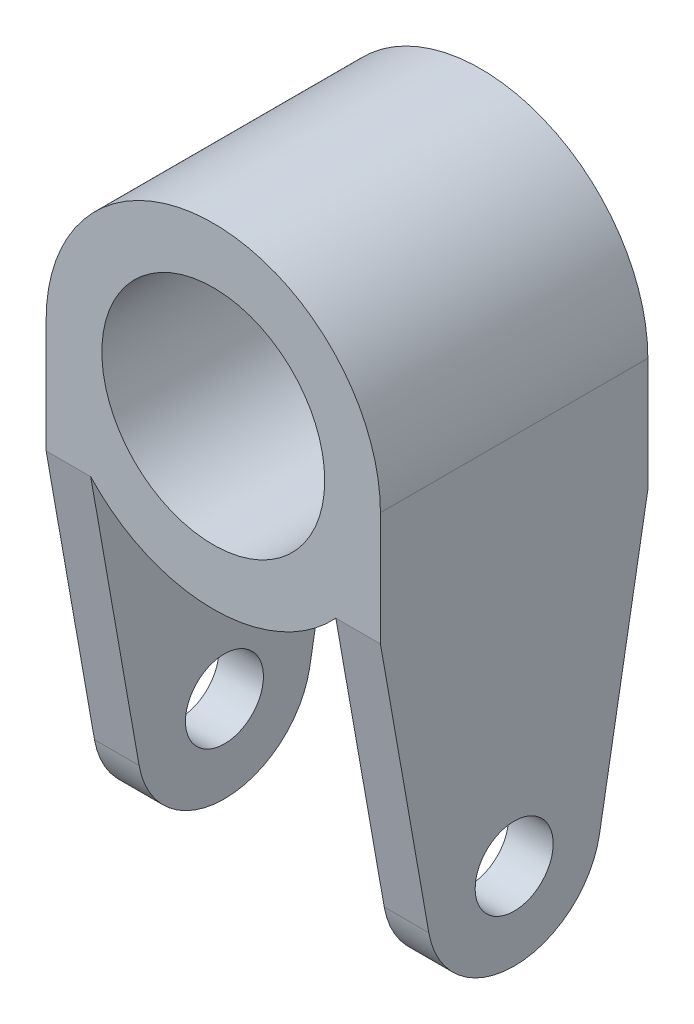
ISO-10303-21;
HEADER;
FILE_DESCRIPTION(('STEP AP214'),'2;1');
FILE_NAME('part.step','',(''),(''),'','','');
FILE_SCHEMA(('AUTOMOTIVE_DESIGN { 1 0 10303 214 1 1 1 1 }'));
ENDSEC;
DATA;
#1=APPLICATION_CONTEXT('core data for automotive mechanical design processes');
#2=APPLICATION_PROTOCOL_DEFINITION('international standard','automotive_design',2000,#1);
#3=PRODUCT_CONTEXT('',#1,'mechanical');
#4=PRODUCT('Part','Part','',(#3));
#5=PRODUCT_RELATED_PRODUCT_CATEGORY('part','',(#4));
#6=PRODUCT_DEFINITION_FORMATION('','',#4);
#7=PRODUCT_DEFINITION_CONTEXT('part definition',#1,'design');
#8=PRODUCT_DEFINITION('design','',#6,#7);
#9=PRODUCT_DEFINITION_SHAPE('','',#8);
#10=(LENGTH_UNIT() NAMED_UNIT(*) SI_UNIT(.MILLI.,.METRE.));
#11=(NAMED_UNIT(*) PLANE_ANGLE_UNIT() SI_UNIT($,.RADIAN.));
#12=(NAMED_UNIT(*) SI_UNIT($,.STERADIAN.) SOLID_ANGLE_UNIT());
#13=UNCERTAINTY_MEASURE_WITH_UNIT(LENGTH_MEASURE(1.E-05),#10,'distance_accuracy_value','');
#14=(GEOMETRIC_REPRESENTATION_CONTEXT(3) GLOBAL_UNCERTAINTY_ASSIGNED_CONTEXT((#13)) GLOBAL_UNIT_ASSIGNED_CONTEXT((#10,
#11,#12)) REPRESENTATION_CONTEXT('',''));
#15=CARTESIAN_POINT('',(0.,0.,0.));
#16=DIRECTION('',(0.,0.,1.));
#17=DIRECTION('',(1.,0.,0.));
#18=AXIS2_PLACEMENT_3D('',#15,#16,#17);
#19=CARTESIAN_POINT('',(0.,0.,24.));
#20=DIRECTION('',(0.,0.,1.));
#21=DIRECTION('',(1.,0.,0.));
#22=AXIS2_PLACEMENT_3D('',#19,#20,#21);
#23=PLANE('',#22);
#24=DIRECTION('',(1.,0.,0.));
#25=VECTOR('',#24,1.);
#26=CARTESIAN_POINT('',(-15.001,-10.1980390271856,24.));
#27=LINE('',#26,#25);
#28=CARTESIAN_POINT('',(11.,-10.1980390271856,24.));
#29=VERTEX_POINT('',#28);
#30=CARTESIAN_POINT('',(15.,-10.1980390271856,24.));
#31=VERTEX_POINT('',#30);
#32=EDGE_CURVE('E113',#29,#31,#27,.T.);
#33=ORIENTED_EDGE('',*,*,#32,.T.);
#34=DIRECTION('',(0.,1.,0.));
#35=VECTOR('',#34,1.);
#36=CARTESIAN_POINT('',(15.,-22.,24.));
#37=LINE('',#36,#35);
#38=CARTESIAN_POINT('',(15.,0.,24.));
#39=VERTEX_POINT('',#38);
#40=EDGE_CURVE('E145',#31,#39,#37,.T.);
#41=ORIENTED_EDGE('',*,*,#40,.T.);
#42=CARTESIAN_POINT('',(0.,0.,24.));
#43=DIRECTION('',(0.,0.,1.));
#44=DIRECTION('',(1.,0.,0.));
#45=AXIS2_PLACEMENT_3D('',#42,#43,#44);
#46=CIRCLE('',#45,15.);
#47=CARTESIAN_POINT('',(-15.,0.,24.));
#48=VERTEX_POINT('',#47);
#49=EDGE_CURVE('E159',#39,#48,#46,.T.);
#50=ORIENTED_EDGE('',*,*,#49,.T.);
#51=DIRECTION('',(0.,-1.,0.));
#52=VECTOR('',#51,1.);
#53=CARTESIAN_POINT('',(-15.,0.,24.));
#54=LINE('',#53,#52);
#55=CARTESIAN_POINT('',(-15.,-10.1980390271856,24.));
#56=VERTEX_POINT('',#55);
#57=EDGE_CURVE('E146',#48,#56,#54,.T.);
#58=ORIENTED_EDGE('',*,*,#57,.T.);
#59=DIRECTION('',(-1.,0.,0.));
#60=VECTOR('',#59,1.);
#61=CARTESIAN_POINT('',(15.001,-10.1980390271856,24.));
#62=LINE('',#61,#60);
#63=CARTESIAN_POINT('',(-11.,-10.1980390271856,24.));
#64=VERTEX_POINT('',#63);
#65=EDGE_CURVE('E141',#64,#56,#62,.T.);
#66=ORIENTED_EDGE('',*,*,#65,.F.);
#67=CARTESIAN_POINT('',(0.,0.,24.));
#68=DIRECTION('',(0.,0.,1.));
#69=DIRECTION('',(1.,0.,0.));
#70=AXIS2_PLACEMENT_3D('',#67,#68,#69);
#71=CIRCLE('',#70,15.);
#72=EDGE_CURVE('E138',#64,#29,#71,.T.);
#73=ORIENTED_EDGE('',*,*,#72,.T.);
#74=EDGE_LOOP('',(#33,#41,#50,#58,#66,#73));
#75=FACE_BOUND('',#74,.T.);
#76=CARTESIAN_POINT('',(0.,0.,24.));
#77=DIRECTION('',(0.,0.,1.));
#78=DIRECTION('',(1.,0.,0.));
#79=AXIS2_PLACEMENT_3D('',#76,#77,#78);
#80=CIRCLE('',#79,10.);
#81=CARTESIAN_POINT('',(10.,0.,24.));
#82=VERTEX_POINT('',#81);
#83=EDGE_CURVE('E167',#82,#82,#80,.T.);
#84=ORIENTED_EDGE('',*,*,#83,.F.);
#85=EDGE_LOOP('',(#84));
#86=FACE_BOUND('',#85,.T.);
#87=ADVANCED_FACE('F36',(#75,#86),#23,.T.);
#88=CARTESIAN_POINT('',(0.,0.,0.));
#89=DIRECTION('',(0.,0.,1.));
#90=DIRECTION('',(1.,0.,0.));
#91=AXIS2_PLACEMENT_3D('',#88,#89,#90);
#92=PLANE('',#91);
#93=DIRECTION('',(0.,1.,0.));
#94=VECTOR('',#93,1.);
#95=CARTESIAN_POINT('',(15.,0.,0.));
#96=LINE('',#95,#94);
#97=CARTESIAN_POINT('',(15.,-10.1980390271856,0.));
#98=VERTEX_POINT('',#97);
#99=CARTESIAN_POINT('',(15.,0.,0.));
#100=VERTEX_POINT('',#99);
#101=EDGE_CURVE('E157',#98,#100,#96,.T.);
#102=ORIENTED_EDGE('',*,*,#101,.F.);
#103=DIRECTION('',(1.,0.,0.));
#104=VECTOR('',#103,1.);
#105=CARTESIAN_POINT('',(-15.001,-10.1980390271856,0.));
#106=LINE('',#105,#104);
#107=CARTESIAN_POINT('',(11.,-10.1980390271856,0.));
#108=VERTEX_POINT('',#107);
#109=EDGE_CURVE('E123',#108,#98,#106,.T.);
#110=ORIENTED_EDGE('',*,*,#109,.F.);
#111=CARTESIAN_POINT('',(0.,0.,0.));
#112=DIRECTION('',(0.,0.,1.));
#113=DIRECTION('',(1.,0.,0.));
#114=AXIS2_PLACEMENT_3D('',#111,#112,#113);
#115=CIRCLE('',#114,15.);
#116=CARTESIAN_POINT('',(-11.,-10.1980390271856,0.));
#117=VERTEX_POINT('',#116);
#118=EDGE_CURVE('E151',#117,#108,#115,.T.);
#119=ORIENTED_EDGE('',*,*,#118,.F.);
#120=DIRECTION('',(-1.,0.,0.));
#121=VECTOR('',#120,1.);
#122=CARTESIAN_POINT('',(15.001,-10.1980390271856,0.));
#123=LINE('',#122,#121);
#124=CARTESIAN_POINT('',(-15.,-10.1980390271856,0.));
#125=VERTEX_POINT('',#124);
#126=EDGE_CURVE('E183',#117,#125,#123,.T.);
#127=ORIENTED_EDGE('',*,*,#126,.T.);
#128=DIRECTION('',(0.,-1.,0.));
#129=VECTOR('',#128,1.);
#130=CARTESIAN_POINT('',(-15.,-15.,0.));
#131=LINE('',#130,#129);
#132=CARTESIAN_POINT('',(-15.,0.,0.));
#133=VERTEX_POINT('',#132);
#134=EDGE_CURVE('E161',#133,#125,#131,.T.);
#135=ORIENTED_EDGE('',*,*,#134,.F.);
#136=CARTESIAN_POINT('',(0.,0.,0.));
#137=DIRECTION('',(0.,0.,1.));
#138=DIRECTION('',(1.,0.,0.));
#139=AXIS2_PLACEMENT_3D('',#136,#137,#138);
#140=CIRCLE('',#139,15.);
#141=EDGE_CURVE('E164',#100,#133,#140,.T.);
#142=ORIENTED_EDGE('',*,*,#141,.F.);
#143=EDGE_LOOP('',(#102,#110,#119,#127,#135,#142));
#144=FACE_BOUND('',#143,.T.);
#145=CARTESIAN_POINT('',(0.,0.,0.));
#146=DIRECTION('',(0.,0.,1.));
#147=DIRECTION('',(1.,0.,0.));
#148=AXIS2_PLACEMENT_3D('',#145,#146,#147);
#149=CIRCLE('',#148,10.);
#150=CARTESIAN_POINT('',(10.,0.,0.));
#151=VERTEX_POINT('',#150);
#152=EDGE_CURVE('E172',#151,#151,#149,.T.);
#153=ORIENTED_EDGE('',*,*,#152,.T.);
#154=EDGE_LOOP('',(#153));
#155=FACE_BOUND('',#154,.T.);
#156=ADVANCED_FACE('F251',(#144,#155),#92,.F.);
#157=CARTESIAN_POINT('',(0.,0.,24.));
#158=DIRECTION('',(0.,0.,-1.));
#159=DIRECTION('',(-1.,0.,0.));
#160=AXIS2_PLACEMENT_3D('',#157,#158,#159);
#161=CYLINDRICAL_SURFACE('',#160,15.);
#162=ORIENTED_EDGE('',*,*,#141,.T.);
#163=DIRECTION('',(0.,0.,-1.));
#164=VECTOR('',#163,1.);
#165=CARTESIAN_POINT('',(-15.,0.,24.));
#166=LINE('',#165,#164);
#167=EDGE_CURVE('E11',#48,#133,#166,.T.);
#168=ORIENTED_EDGE('',*,*,#167,.F.);
#169=ORIENTED_EDGE('',*,*,#49,.F.);
#170=DIRECTION('',(0.,0.,-1.));
#171=VECTOR('',#170,1.);
#172=CARTESIAN_POINT('',(15.,0.,24.));
#173=LINE('',#172,#171);
#174=EDGE_CURVE('E152',#39,#100,#173,.T.);
#175=ORIENTED_EDGE('',*,*,#174,.T.);
#176=EDGE_LOOP('',(#162,#168,#169,#175));
#177=FACE_BOUND('',#176,.T.);
#178=ADVANCED_FACE('F38',(#177),#161,.T.);
#179=CARTESIAN_POINT('',(-15.,-15.,24.));
#180=DIRECTION('',(1.,0.,0.));
#181=DIRECTION('',(0.,1.,0.));
#182=AXIS2_PLACEMENT_3D('',#179,#180,#181);
#183=PLANE('',#182);
#184=CARTESIAN_POINT('',(-15.,-33.4677805558276,12.));
#185=DIRECTION('',(-1.,0.,0.));
#186=DIRECTION('',(0.,-1.,0.));
#187=AXIS2_PLACEMENT_3D('',#184,#185,#186);
#188=CIRCLE('',#187,3.50000000000001);
#189=CARTESIAN_POINT('',(-15.,-36.9677805558276,12.));
#190=VERTEX_POINT('',#189);
#191=EDGE_CURVE('E200',#190,#190,#188,.T.);
#192=ORIENTED_EDGE('',*,*,#191,.F.);
#193=EDGE_LOOP('',(#192));
#194=FACE_BOUND('',#193,.T.);
#195=ORIENTED_EDGE('',*,*,#134,.T.);
#196=DIRECTION('',(0.,0.984807753012207,-0.173648177666935));
#197=VECTOR('',#196,1.);
#198=CARTESIAN_POINT('',(-15.,-10.1980390271856,0.));
#199=LINE('',#198,#197);
#200=CARTESIAN_POINT('',(-15.,-34.8182328524907,4.34120444167337));
#201=VERTEX_POINT('',#200);
#202=EDGE_CURVE('E192',#201,#125,#199,.T.);
#203=ORIENTED_EDGE('',*,*,#202,.F.);
#204=CARTESIAN_POINT('',(-15.,-33.4677805558276,12.));
#205=DIRECTION('',(1.,0.,0.));
#206=DIRECTION('',(0.,-1.,0.));
#207=AXIS2_PLACEMENT_3D('',#204,#205,#206);
#208=CIRCLE('',#207,7.77694482491721);
#209=CARTESIAN_POINT('',(-15.,-34.8182328524908,19.6587955583266));
#210=VERTEX_POINT('',#209);
#211=EDGE_CURVE('E195',#210,#201,#208,.T.);
#212=ORIENTED_EDGE('',*,*,#211,.F.);
#213=DIRECTION('',(0.,-0.984807753012207,-0.173648177666935));
#214=VECTOR('',#213,1.);
#215=CARTESIAN_POINT('',(-15.,-34.8182328524908,19.6587955583266));
#216=LINE('',#215,#214);
#217=EDGE_CURVE('E180',#56,#210,#216,.T.);
#218=ORIENTED_EDGE('',*,*,#217,.F.);
#219=ORIENTED_EDGE('',*,*,#57,.F.);
#220=ORIENTED_EDGE('',*,*,#167,.T.);
#221=EDGE_LOOP('',(#195,#203,#212,#218,#219,#220));
#222=FACE_BOUND('',#221,.T.);
#223=ADVANCED_FACE('F239',(#194,#222),#183,.F.);
#224=CARTESIAN_POINT('',(-11.,-42.,24.));
#225=DIRECTION('',(-1.,0.,0.));
#226=DIRECTION('',(0.,-1.,0.));
#227=AXIS2_PLACEMENT_3D('',#224,#225,#226);
#228=PLANE('',#227);
#229=CARTESIAN_POINT('',(-11.,-33.4677805558276,12.));
#230=DIRECTION('',(-1.,0.,0.));
#231=DIRECTION('',(0.,-1.,0.));
#232=AXIS2_PLACEMENT_3D('',#229,#230,#231);
#233=CIRCLE('',#232,3.50000000000001);
#234=CARTESIAN_POINT('',(-11.,-36.9677805558276,12.));
#235=VERTEX_POINT('',#234);
#236=EDGE_CURVE('E187',#235,#235,#233,.F.);
#237=ORIENTED_EDGE('',*,*,#236,.F.);
#238=EDGE_LOOP('',(#237));
#239=FACE_BOUND('',#238,.T.);
#240=CARTESIAN_POINT('',(-11.,-33.4677805558276,12.));
#241=DIRECTION('',(-1.,0.,0.));
#242=DIRECTION('',(0.,-1.,0.));
#243=AXIS2_PLACEMENT_3D('',#240,#241,#242);
#244=CIRCLE('',#243,7.77694482491721);
#245=CARTESIAN_POINT('',(-11.,-34.8182328524907,4.34120444167337));
#246=VERTEX_POINT('',#245);
#247=CARTESIAN_POINT('',(-11.,-34.8182328524908,19.6587955583266));
#248=VERTEX_POINT('',#247);
#249=EDGE_CURVE('E59',#246,#248,#244,.T.);
#250=ORIENTED_EDGE('',*,*,#249,.F.);
#251=DIRECTION('',(0.,-0.984807753012207,0.173648177666935));
#252=VECTOR('',#251,1.);
#253=CARTESIAN_POINT('',(-11.,-10.1980390271856,0.));
#254=LINE('',#253,#252);
#255=EDGE_CURVE('E189',#117,#246,#254,.T.);
#256=ORIENTED_EDGE('',*,*,#255,.F.);
#257=DIRECTION('',(0.,0.,-1.));
#258=VECTOR('',#257,1.);
#259=CARTESIAN_POINT('',(-11.,-10.1980390271856,24.));
#260=LINE('',#259,#258);
#261=EDGE_CURVE('E44',#64,#117,#260,.T.);
#262=ORIENTED_EDGE('',*,*,#261,.F.);
#263=DIRECTION('',(0.,0.984807753012207,0.173648177666935));
#264=VECTOR('',#263,1.);
#265=CARTESIAN_POINT('',(-11.,-34.8182328524908,19.6587955583266));
#266=LINE('',#265,#264);
#267=EDGE_CURVE('E175',#248,#64,#266,.T.);
#268=ORIENTED_EDGE('',*,*,#267,.F.);
#269=EDGE_LOOP('',(#250,#256,#262,#268));
#270=FACE_BOUND('',#269,.T.);
#271=ADVANCED_FACE('F247',(#239,#270),#228,.F.);
#272=CARTESIAN_POINT('',(0.,0.,24.));
#273=DIRECTION('',(0.,0.,-1.));
#274=DIRECTION('',(-1.,0.,0.));
#275=AXIS2_PLACEMENT_3D('',#272,#273,#274);
#276=CYLINDRICAL_SURFACE('',#275,15.);
#277=ORIENTED_EDGE('',*,*,#118,.T.);
#278=DIRECTION('',(0.,0.,-1.));
#279=VECTOR('',#278,1.);
#280=CARTESIAN_POINT('',(11.,-10.1980390271856,24.));
#281=LINE('',#280,#279);
#282=EDGE_CURVE('E131',#29,#108,#281,.T.);
#283=ORIENTED_EDGE('',*,*,#282,.F.);
#284=ORIENTED_EDGE('',*,*,#72,.F.);
#285=ORIENTED_EDGE('',*,*,#261,.T.);
#286=EDGE_LOOP('',(#277,#283,#284,#285));
#287=FACE_BOUND('',#286,.T.);
#288=ADVANCED_FACE('F149',(#287),#276,.T.);
#289=CARTESIAN_POINT('',(11.,-42.,24.));
#290=DIRECTION('',(1.,0.,0.));
#291=DIRECTION('',(0.,0.,-1.));
#292=AXIS2_PLACEMENT_3D('',#289,#290,#291);
#293=PLANE('',#292);
#294=CARTESIAN_POINT('',(11.,-33.4677805558276,12.));
#295=DIRECTION('',(1.,0.,0.));
#296=DIRECTION('',(0.,0.,-1.));
#297=AXIS2_PLACEMENT_3D('',#294,#295,#296);
#298=CIRCLE('',#297,3.50000000000001);
#299=CARTESIAN_POINT('',(11.,-29.9677805558276,12.));
#300=VERTEX_POINT('',#299);
#301=EDGE_CURVE('E134',#300,#300,#298,.F.);
#302=ORIENTED_EDGE('',*,*,#301,.F.);
#303=EDGE_LOOP('',(#302));
#304=FACE_BOUND('',#303,.T.);
#305=ORIENTED_EDGE('',*,*,#282,.T.);
#306=DIRECTION('',(0.,0.984807753012207,-0.173648177666935));
#307=VECTOR('',#306,1.);
#308=CARTESIAN_POINT('',(11.,-10.1980390271856,0.));
#309=LINE('',#308,#307);
#310=CARTESIAN_POINT('',(11.,-34.8182328524908,4.34120444167337));
#311=VERTEX_POINT('',#310);
#312=EDGE_CURVE('E206',#311,#108,#309,.T.);
#313=ORIENTED_EDGE('',*,*,#312,.F.);
#314=CARTESIAN_POINT('',(11.,-33.4677805558276,12.));
#315=DIRECTION('',(1.,0.,0.));
#316=DIRECTION('',(0.,0.,-1.));
#317=AXIS2_PLACEMENT_3D('',#314,#315,#316);
#318=CIRCLE('',#317,7.77694482491721);
#319=CARTESIAN_POINT('',(11.,-34.8182328524908,19.6587955583266));
#320=VERTEX_POINT('',#319);
#321=EDGE_CURVE('E133',#320,#311,#318,.T.);
#322=ORIENTED_EDGE('',*,*,#321,.F.);
#323=DIRECTION('',(0.,-0.984807753012207,-0.173648177666935));
#324=VECTOR('',#323,1.);
#325=CARTESIAN_POINT('',(11.,-34.8182328524908,19.6587955583266));
#326=LINE('',#325,#324);
#327=EDGE_CURVE('E116',#29,#320,#326,.T.);
#328=ORIENTED_EDGE('',*,*,#327,.F.);
#329=EDGE_LOOP('',(#305,#313,#322,#328));
#330=FACE_BOUND('',#329,.T.);
#331=ADVANCED_FACE('F128',(#304,#330),#293,.F.);
#332=CARTESIAN_POINT('',(15.,0.,24.));
#333=DIRECTION('',(-1.,0.,0.));
#334=DIRECTION('',(0.,-1.,0.));
#335=AXIS2_PLACEMENT_3D('',#332,#333,#334);
#336=PLANE('',#335);
#337=CARTESIAN_POINT('',(15.,-33.4677805558276,12.));
#338=DIRECTION('',(1.,0.,0.));
#339=DIRECTION('',(0.,1.,0.));
#340=AXIS2_PLACEMENT_3D('',#337,#338,#339);
#341=CIRCLE('',#340,3.50000000000001);
#342=CARTESIAN_POINT('',(15.,-29.9677805558276,12.));
#343=VERTEX_POINT('',#342);
#344=EDGE_CURVE('E219',#343,#343,#341,.T.);
#345=ORIENTED_EDGE('',*,*,#344,.F.);
#346=EDGE_LOOP('',(#345));
#347=FACE_BOUND('',#346,.T.);
#348=CARTESIAN_POINT('',(15.,-33.4677805558276,12.));
#349=DIRECTION('',(-1.,0.,0.));
#350=DIRECTION('',(0.,1.,0.));
#351=AXIS2_PLACEMENT_3D('',#348,#349,#350);
#352=CIRCLE('',#351,7.77694482491721);
#353=CARTESIAN_POINT('',(15.,-34.8182328524908,4.34120444167337));
#354=VERTEX_POINT('',#353);
#355=CARTESIAN_POINT('',(15.,-34.8182328524908,19.6587955583266));
#356=VERTEX_POINT('',#355);
#357=EDGE_CURVE('E51',#354,#356,#352,.T.);
#358=ORIENTED_EDGE('',*,*,#357,.F.);
#359=DIRECTION('',(0.,-0.984807753012207,0.173648177666935));
#360=VECTOR('',#359,1.);
#361=CARTESIAN_POINT('',(15.,-10.1980390271856,0.));
#362=LINE('',#361,#360);
#363=EDGE_CURVE('E208',#98,#354,#362,.T.);
#364=ORIENTED_EDGE('',*,*,#363,.F.);
#365=ORIENTED_EDGE('',*,*,#101,.T.);
#366=ORIENTED_EDGE('',*,*,#174,.F.);
#367=ORIENTED_EDGE('',*,*,#40,.F.);
#368=DIRECTION('',(0.,0.984807753012207,0.173648177666935));
#369=VECTOR('',#368,1.);
#370=CARTESIAN_POINT('',(15.,-34.8182328524908,19.6587955583266));
#371=LINE('',#370,#369);
#372=EDGE_CURVE('E119',#356,#31,#371,.T.);
#373=ORIENTED_EDGE('',*,*,#372,.F.);
#374=EDGE_LOOP('',(#358,#364,#365,#366,#367,#373));
#375=FACE_BOUND('',#374,.T.);
#376=ADVANCED_FACE('F226',(#347,#375),#336,.F.);
#377=CARTESIAN_POINT('',(0.,0.,24.));
#378=DIRECTION('',(0.,0.,-1.));
#379=DIRECTION('',(-1.,0.,0.));
#380=AXIS2_PLACEMENT_3D('',#377,#378,#379);
#381=CYLINDRICAL_SURFACE('',#380,10.);
#382=ORIENTED_EDGE('',*,*,#83,.T.);
#383=EDGE_LOOP('',(#382));
#384=FACE_BOUND('',#383,.T.);
#385=ORIENTED_EDGE('',*,*,#152,.F.);
#386=EDGE_LOOP('',(#385));
#387=FACE_BOUND('',#386,.T.);
#388=ADVANCED_FACE('F229',(#384,#387),#381,.F.);
#389=CARTESIAN_POINT('',(15.001,-10.1980390271856,0.));
#390=DIRECTION('',(0.,0.173648177666935,0.984807753012207));
#391=DIRECTION('',(0.,-0.984807753012207,0.173648177666935));
#392=AXIS2_PLACEMENT_3D('',#389,#390,#391);
#393=PLANE('',#392);
#394=ORIENTED_EDGE('',*,*,#255,.T.);
#395=DIRECTION('',(-1.,0.,0.));
#396=VECTOR('',#395,1.);
#397=CARTESIAN_POINT('',(15.001,-34.8182328524907,4.34120444167337));
#398=LINE('',#397,#396);
#399=EDGE_CURVE('E181',#246,#201,#398,.T.);
#400=ORIENTED_EDGE('',*,*,#399,.T.);
#401=ORIENTED_EDGE('',*,*,#202,.T.);
#402=ORIENTED_EDGE('',*,*,#126,.F.);
#403=EDGE_LOOP('',(#394,#400,#401,#402));
#404=FACE_BOUND('',#403,.T.);
#405=ADVANCED_FACE('F300',(#404),#393,.F.);
#406=CARTESIAN_POINT('',(15.001,-33.4677805558276,12.));
#407=DIRECTION('',(-1.,0.,0.));
#408=DIRECTION('',(0.,-1.,0.));
#409=AXIS2_PLACEMENT_3D('',#406,#407,#408);
#410=CYLINDRICAL_SURFACE('',#409,7.77694482491721);
#411=ORIENTED_EDGE('',*,*,#249,.T.);
#412=DIRECTION('',(-1.,0.,0.));
#413=VECTOR('',#412,1.);
#414=CARTESIAN_POINT('',(15.001,-34.8182328524907,19.6587955583266));
#415=LINE('',#414,#413);
#416=EDGE_CURVE('E178',#248,#210,#415,.T.);
#417=ORIENTED_EDGE('',*,*,#416,.T.);
#418=ORIENTED_EDGE('',*,*,#211,.T.);
#419=ORIENTED_EDGE('',*,*,#399,.F.);
#420=EDGE_LOOP('',(#411,#417,#418,#419));
#421=FACE_BOUND('',#420,.T.);
#422=ADVANCED_FACE('F296',(#421),#410,.T.);
#423=CARTESIAN_POINT('',(15.001,-34.8182328524907,19.6587955583266));
#424=DIRECTION('',(0.,0.173648177666935,-0.984807753012207));
#425=DIRECTION('',(0.,0.984807753012207,0.173648177666935));
#426=AXIS2_PLACEMENT_3D('',#423,#424,#425);
#427=PLANE('',#426);
#428=ORIENTED_EDGE('',*,*,#267,.T.);
#429=ORIENTED_EDGE('',*,*,#65,.T.);
#430=ORIENTED_EDGE('',*,*,#217,.T.);
#431=ORIENTED_EDGE('',*,*,#416,.F.);
#432=EDGE_LOOP('',(#428,#429,#430,#431));
#433=FACE_BOUND('',#432,.T.);
#434=ADVANCED_FACE('F244',(#433),#427,.F.);
#435=CARTESIAN_POINT('',(15.001,-33.4677805558276,12.));
#436=DIRECTION('',(-1.,0.,0.));
#437=DIRECTION('',(0.,-1.,0.));
#438=AXIS2_PLACEMENT_3D('',#435,#436,#437);
#439=CYLINDRICAL_SURFACE('',#438,3.50000000000001);
#440=ORIENTED_EDGE('',*,*,#191,.T.);
#441=EDGE_LOOP('',(#440));
#442=FACE_BOUND('',#441,.T.);
#443=ORIENTED_EDGE('',*,*,#236,.T.);
#444=EDGE_LOOP('',(#443));
#445=FACE_BOUND('',#444,.T.);
#446=ADVANCED_FACE('F263',(#442,#445),#439,.F.);
#447=CARTESIAN_POINT('',(-15.001,-10.1980390271856,0.));
#448=DIRECTION('',(0.,0.173648177666935,0.984807753012207));
#449=DIRECTION('',(0.,-0.984807753012207,0.173648177666935));
#450=AXIS2_PLACEMENT_3D('',#447,#448,#449);
#451=PLANE('',#450);
#452=ORIENTED_EDGE('',*,*,#312,.T.);
#453=ORIENTED_EDGE('',*,*,#109,.T.);
#454=ORIENTED_EDGE('',*,*,#363,.T.);
#455=DIRECTION('',(1.,0.,0.));
#456=VECTOR('',#455,1.);
#457=CARTESIAN_POINT('',(-15.001,-34.8182328524908,4.34120444167337));
#458=LINE('',#457,#456);
#459=EDGE_CURVE('E212',#311,#354,#458,.T.);
#460=ORIENTED_EDGE('',*,*,#459,.F.);
#461=EDGE_LOOP('',(#452,#453,#454,#460));
#462=FACE_BOUND('',#461,.T.);
#463=ADVANCED_FACE('F254',(#462),#451,.F.);
#464=CARTESIAN_POINT('',(-15.001,-33.4677805558276,12.));
#465=DIRECTION('',(1.,0.,0.));
#466=DIRECTION('',(0.,1.,0.));
#467=AXIS2_PLACEMENT_3D('',#464,#465,#466);
#468=CYLINDRICAL_SURFACE('',#467,7.77694482491721);
#469=ORIENTED_EDGE('',*,*,#321,.T.);
#470=ORIENTED_EDGE('',*,*,#459,.T.);
#471=ORIENTED_EDGE('',*,*,#357,.T.);
#472=DIRECTION('',(1.,0.,0.));
#473=VECTOR('',#472,1.);
#474=CARTESIAN_POINT('',(-15.001,-34.8182328524908,19.6587955583266));
#475=LINE('',#474,#473);
#476=EDGE_CURVE('E124',#320,#356,#475,.T.);
#477=ORIENTED_EDGE('',*,*,#476,.F.);
#478=EDGE_LOOP('',(#469,#470,#471,#477));
#479=FACE_BOUND('',#478,.T.);
#480=ADVANCED_FACE('F255',(#479),#468,.T.);
#481=CARTESIAN_POINT('',(-15.001,-34.8182328524908,19.6587955583266));
#482=DIRECTION('',(0.,0.173648177666935,-0.984807753012207));
#483=DIRECTION('',(0.,0.984807753012207,0.173648177666935));
#484=AXIS2_PLACEMENT_3D('',#481,#482,#483);
#485=PLANE('',#484);
#486=ORIENTED_EDGE('',*,*,#327,.T.);
#487=ORIENTED_EDGE('',*,*,#476,.T.);
#488=ORIENTED_EDGE('',*,*,#372,.T.);
#489=ORIENTED_EDGE('',*,*,#32,.F.);
#490=EDGE_LOOP('',(#486,#487,#488,#489));
#491=FACE_BOUND('',#490,.T.);
#492=ADVANCED_FACE('F115',(#491),#485,.F.);
#493=CARTESIAN_POINT('',(-15.001,-33.4677805558276,12.));
#494=DIRECTION('',(1.,0.,0.));
#495=DIRECTION('',(0.,1.,0.));
#496=AXIS2_PLACEMENT_3D('',#493,#494,#495);
#497=CYLINDRICAL_SURFACE('',#496,3.50000000000001);
#498=CARTESIAN_POINT('',(15.,-29.9677805558276,12.));
#499=CARTESIAN_POINT('',(14.9583333333333,-29.9677805558276,12.));
#500=CARTESIAN_POINT('',(14.9166666666667,-29.9677805558276,12.));
#501=CARTESIAN_POINT('',(14.8333333333333,-29.9677805558276,12.));
#502=CARTESIAN_POINT('',(14.7916666666667,-29.9677805558276,12.));
#503=CARTESIAN_POINT('',(14.7083333333333,-29.9677805558276,12.));
#504=CARTESIAN_POINT('',(14.6666666666667,-29.9677805558276,12.));
#505=CARTESIAN_POINT('',(14.5833333333333,-29.9677805558276,12.));
#506=CARTESIAN_POINT('',(14.5416666666667,-29.9677805558276,12.));
#507=CARTESIAN_POINT('',(14.4583333333333,-29.9677805558276,12.));
#508=CARTESIAN_POINT('',(14.4166666666667,-29.9677805558276,12.));
#509=CARTESIAN_POINT('',(14.3333333333333,-29.9677805558276,12.));
#510=CARTESIAN_POINT('',(14.2916666666667,-29.9677805558276,12.));
#511=CARTESIAN_POINT('',(14.2083333333333,-29.9677805558276,12.));
#512=CARTESIAN_POINT('',(14.1666666666667,-29.9677805558276,12.));
#513=CARTESIAN_POINT('',(14.0833333333333,-29.9677805558276,12.));
#514=CARTESIAN_POINT('',(14.0416666666667,-29.9677805558276,12.));
#515=CARTESIAN_POINT('',(13.9583333333333,-29.9677805558276,12.));
#516=CARTESIAN_POINT('',(13.9166666666667,-29.9677805558276,12.));
#517=CARTESIAN_POINT('',(13.8333333333333,-29.9677805558276,12.));
#518=CARTESIAN_POINT('',(13.7916666666667,-29.9677805558276,12.));
#519=CARTESIAN_POINT('',(13.7083333333333,-29.9677805558276,12.));
#520=CARTESIAN_POINT('',(13.6666666666667,-29.9677805558276,12.));
#521=CARTESIAN_POINT('',(13.5833333333333,-29.9677805558276,12.));
#522=CARTESIAN_POINT('',(13.5416666666667,-29.9677805558276,12.));
#523=CARTESIAN_POINT('',(13.4583333333333,-29.9677805558276,12.));
#524=CARTESIAN_POINT('',(13.4166666666667,-29.9677805558276,12.));
#525=CARTESIAN_POINT('',(13.3333333333333,-29.9677805558276,12.));
#526=CARTESIAN_POINT('',(13.2916666666667,-29.9677805558276,12.));
#527=CARTESIAN_POINT('',(13.2083333333333,-29.9677805558276,12.));
#528=CARTESIAN_POINT('',(13.1666666666667,-29.9677805558276,12.));
#529=CARTESIAN_POINT('',(13.0833333333333,-29.9677805558276,12.));
#530=CARTESIAN_POINT('',(13.0416666666667,-29.9677805558276,12.));
#531=CARTESIAN_POINT('',(12.9583333333333,-29.9677805558276,12.));
#532=CARTESIAN_POINT('',(12.9166666666667,-29.9677805558276,12.));
#533=CARTESIAN_POINT('',(12.8333333333333,-29.9677805558276,12.));
#534=CARTESIAN_POINT('',(12.7916666666667,-29.9677805558276,12.));
#535=CARTESIAN_POINT('',(12.7083333333333,-29.9677805558276,12.));
#536=CARTESIAN_POINT('',(12.6666666666667,-29.9677805558276,12.));
#537=CARTESIAN_POINT('',(12.5833333333333,-29.9677805558276,12.));
#538=CARTESIAN_POINT('',(12.5416666666667,-29.9677805558276,12.));
#539=CARTESIAN_POINT('',(12.4583333333333,-29.9677805558276,12.));
#540=CARTESIAN_POINT('',(12.4166666666667,-29.9677805558276,12.));
#541=CARTESIAN_POINT('',(12.3333333333333,-29.9677805558276,12.));
#542=CARTESIAN_POINT('',(12.2916666666667,-29.9677805558276,12.));
#543=CARTESIAN_POINT('',(12.2083333333333,-29.9677805558276,12.));
#544=CARTESIAN_POINT('',(12.1666666666667,-29.9677805558276,12.));
#545=CARTESIAN_POINT('',(12.0833333333333,-29.9677805558276,12.));
#546=CARTESIAN_POINT('',(12.0416666666667,-29.9677805558276,12.));
#547=CARTESIAN_POINT('',(11.9583333333333,-29.9677805558276,12.));
#548=CARTESIAN_POINT('',(11.9166666666667,-29.9677805558276,12.));
#549=CARTESIAN_POINT('',(11.8333333333333,-29.9677805558276,12.));
#550=CARTESIAN_POINT('',(11.7916666666667,-29.9677805558276,12.));
#551=CARTESIAN_POINT('',(11.7083333333333,-29.9677805558276,12.));
#552=CARTESIAN_POINT('',(11.6666666666667,-29.9677805558276,12.));
#553=CARTESIAN_POINT('',(11.5833333333333,-29.9677805558276,12.));
#554=CARTESIAN_POINT('',(11.5416666666667,-29.9677805558276,12.));
#555=CARTESIAN_POINT('',(11.4583333333333,-29.9677805558276,12.));
#556=CARTESIAN_POINT('',(11.4166666666667,-29.9677805558276,12.));
#557=CARTESIAN_POINT('',(11.3333333333333,-29.9677805558276,12.));
#558=CARTESIAN_POINT('',(11.2916666666667,-29.9677805558276,12.));
#559=CARTESIAN_POINT('',(11.2083333333333,-29.9677805558276,12.));
#560=CARTESIAN_POINT('',(11.1666666666667,-29.9677805558276,12.));
#561=CARTESIAN_POINT('',(11.0833333333333,-29.9677805558276,12.));
#562=CARTESIAN_POINT('',(11.0416666666667,-29.9677805558276,12.));
#563=CARTESIAN_POINT('',(11.,-29.9677805558276,12.));
#564=B_SPLINE_CURVE_WITH_KNOTS('',3,(#498,#499,#500,#501,#502,#503,#504,#505,#506,#507,#508,
#509,#510,#511,#512,#513,#514,#515,#516,#517,#518,#519,#520,#521,#522,#523,#524,#525,#526,#527,
#528,#529,#530,#531,#532,#533,#534,#535,#536,#537,#538,#539,#540,#541,#542,#543,#544,#545,#546,
#547,#548,#549,#550,#551,#552,#553,#554,#555,#556,#557,#558,#559,#560,#561,#562,#563),
.UNSPECIFIED.,.F.,.F.,(4,2,2,2,2,2,2,2,2,2,2,2,2,2,2,2,2,2,2,2,2,2,2,2,2,2,2,2,2,2,2,2,4),(0.,
0.125,0.25,0.375,0.5,0.625000000000001,0.750000000000001,0.875000000000001,1.,1.125,1.25,1.375,
1.5,1.625,1.75,1.875,2.,2.125,2.25,2.375,2.5,2.625,2.75,2.875,3.,3.125,3.25,3.375,3.5,3.625,
3.75,3.875,4.),.UNSPECIFIED.);
#565=EDGE_CURVE('BSEAM223',#343,#300,#564,.T.);
#566=ORIENTED_EDGE('',*,*,#344,.T.);
#567=ORIENTED_EDGE('',*,*,#301,.T.);
#568=ORIENTED_EDGE('',*,*,#565,.T.);
#569=ORIENTED_EDGE('',*,*,#565,.F.);
#570=EDGE_LOOP('',(#566,#568,#567,#569));
#571=FACE_BOUND('',#570,.T.);
#572=ADVANCED_FACE('F223',(#571),#497,.F.);
#573=CLOSED_SHELL('',(#87,#156,#178,#223,#271,#288,#331,#376,#388,#405,#422,#434,#446,#463,#480,
#492,#572));
#574=MANIFOLD_SOLID_BREP('B2',#573);
#575=ADVANCED_BREP_SHAPE_REPRESENTATION('',(#18,#574),#14);
#576=SHAPE_DEFINITION_REPRESENTATION(#9,#575);
ENDSEC;
END-ISO-10303-21;
